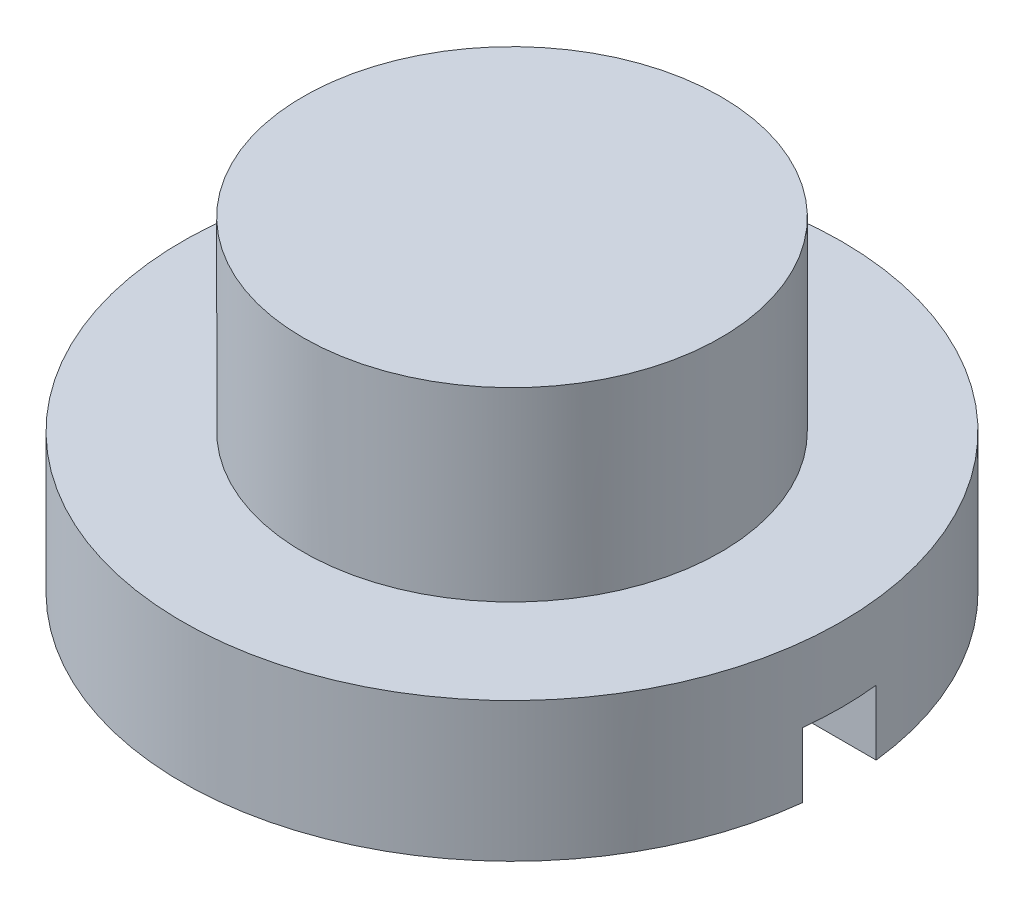
ISO-10303-21;
HEADER;
FILE_DESCRIPTION(('STEP AP214'),'2;1');
FILE_NAME('part.step','',(''),(''),'','','');
FILE_SCHEMA(('AUTOMOTIVE_DESIGN { 1 0 10303 214 1 1 1 1 }'));
ENDSEC;
DATA;
#1=APPLICATION_CONTEXT('core data for automotive mechanical design processes');
#2=APPLICATION_PROTOCOL_DEFINITION('international standard','automotive_design',2000,#1);
#3=PRODUCT_CONTEXT('',#1,'mechanical');
#4=PRODUCT('Part','Part','',(#3));
#5=PRODUCT_RELATED_PRODUCT_CATEGORY('part','',(#4));
#6=PRODUCT_DEFINITION_FORMATION('','',#4);
#7=PRODUCT_DEFINITION_CONTEXT('part definition',#1,'design');
#8=PRODUCT_DEFINITION('design','',#6,#7);
#9=PRODUCT_DEFINITION_SHAPE('','',#8);
#10=(LENGTH_UNIT() NAMED_UNIT(*) SI_UNIT(.MILLI.,.METRE.));
#11=(NAMED_UNIT(*) PLANE_ANGLE_UNIT() SI_UNIT($,.RADIAN.));
#12=(NAMED_UNIT(*) SI_UNIT($,.STERADIAN.) SOLID_ANGLE_UNIT());
#13=UNCERTAINTY_MEASURE_WITH_UNIT(LENGTH_MEASURE(1.E-05),#10,'distance_accuracy_value','');
#14=(GEOMETRIC_REPRESENTATION_CONTEXT(3) GLOBAL_UNCERTAINTY_ASSIGNED_CONTEXT((#13)) GLOBAL_UNIT_ASSIGNED_CONTEXT((#10,
#11,#12)) REPRESENTATION_CONTEXT('',''));
#15=CARTESIAN_POINT('',(0.,0.,0.));
#16=DIRECTION('',(0.,0.,1.));
#17=DIRECTION('',(1.,0.,0.));
#18=AXIS2_PLACEMENT_3D('',#15,#16,#17);
#19=CARTESIAN_POINT('',(-11.7005748371893,-3.81,-6.27870355137579));
#20=DIRECTION('',(0.,-1.,0.));
#21=DIRECTION('',(0.,0.,-1.));
#22=AXIS2_PLACEMENT_3D('',#19,#20,#21);
#23=PLANE('',#22);
#24=DIRECTION('',(1.,0.,0.));
#25=VECTOR('',#24,1.);
#26=CARTESIAN_POINT('',(-11.7005748371893,-3.81,-7.28406224881876));
#27=LINE('',#26,#25);
#28=CARTESIAN_POINT('',(-20.6613528664385,-3.81,-7.28406224881876));
#29=VERTEX_POINT('',#28);
#30=CARTESIAN_POINT('',(-2.73979680794005,-3.81,-7.28406224881876));
#31=VERTEX_POINT('',#30);
#32=EDGE_CURVE('E81',#29,#31,#27,.T.);
#33=ORIENTED_EDGE('',*,*,#32,.F.);
#34=CARTESIAN_POINT('',(-11.7005748371893,-3.81,-6.27870355137579));
#35=DIRECTION('',(0.,-1.,0.));
#36=DIRECTION('',(0.,0.,-1.));
#37=AXIS2_PLACEMENT_3D('',#34,#35,#36);
#38=CIRCLE('',#37,9.017);
#39=EDGE_CURVE('E94',#29,#31,#38,.T.);
#40=ORIENTED_EDGE('',*,*,#39,.T.);
#41=EDGE_LOOP('',(#33,#40));
#42=FACE_BOUND('',#41,.T.);
#43=ADVANCED_FACE('F33',(#42),#23,.T.);
#44=CARTESIAN_POINT('',(-11.7005748371893,5.08,-6.27870355137579));
#45=DIRECTION('',(0.,-1.,0.));
#46=DIRECTION('',(0.,0.,-1.));
#47=AXIS2_PLACEMENT_3D('',#44,#45,#46);
#48=CYLINDRICAL_SURFACE('',#47,5.715);
#49=CARTESIAN_POINT('',(-11.7005748371893,5.08,-6.27870355137579));
#50=DIRECTION('',(0.,1.,0.));
#51=DIRECTION('',(0.,0.,1.));
#52=AXIS2_PLACEMENT_3D('',#49,#50,#51);
#53=CIRCLE('',#52,5.715);
#54=CARTESIAN_POINT('',(-11.7005748371893,5.08,-0.563703551375794));
#55=VERTEX_POINT('',#54);
#56=EDGE_CURVE('E82',#55,#55,#53,.T.);
#57=ORIENTED_EDGE('',*,*,#56,.F.);
#58=EDGE_LOOP('',(#57));
#59=FACE_BOUND('',#58,.T.);
#60=CARTESIAN_POINT('',(-11.7005748371893,0.,-6.27870355137579));
#61=DIRECTION('',(0.,-1.,0.));
#62=DIRECTION('',(0.,0.,-1.));
#63=AXIS2_PLACEMENT_3D('',#60,#61,#62);
#64=CIRCLE('',#63,5.715);
#65=CARTESIAN_POINT('',(-11.7005748371893,0.,-11.9937035513758));
#66=VERTEX_POINT('',#65);
#67=EDGE_CURVE('E93',#66,#66,#64,.T.);
#68=ORIENTED_EDGE('',*,*,#67,.F.);
#69=EDGE_LOOP('',(#68));
#70=FACE_BOUND('',#69,.T.);
#71=ADVANCED_FACE('F35',(#59,#70),#48,.T.);
#72=CARTESIAN_POINT('',(-11.7005748371893,5.08,-6.27870355137579));
#73=DIRECTION('',(0.,1.,0.));
#74=DIRECTION('',(0.,0.,1.));
#75=AXIS2_PLACEMENT_3D('',#72,#73,#74);
#76=PLANE('',#75);
#77=ORIENTED_EDGE('',*,*,#56,.T.);
#78=EDGE_LOOP('',(#77));
#79=FACE_BOUND('',#78,.T.);
#80=ADVANCED_FACE('F116',(#79),#76,.T.);
#81=CARTESIAN_POINT('',(-11.7005748371893,-3.81,-6.27870355137579));
#82=DIRECTION('',(0.,1.,0.));
#83=DIRECTION('',(0.,0.,1.));
#84=AXIS2_PLACEMENT_3D('',#81,#82,#83);
#85=CYLINDRICAL_SURFACE('',#84,9.017);
#86=CARTESIAN_POINT('',(-11.7005748371893,-2.032,-6.27870355137579));
#87=DIRECTION('',(0.,1.,0.));
#88=DIRECTION('',(0.,0.,1.));
#89=AXIS2_PLACEMENT_3D('',#86,#87,#88);
#90=CIRCLE('',#89,9.017);
#91=CARTESIAN_POINT('',(-2.73979680794005,-2.032,-5.27334485393283));
#92=VERTEX_POINT('',#91);
#93=CARTESIAN_POINT('',(-2.73979680794005,-2.032,-7.28406224881876));
#94=VERTEX_POINT('',#93);
#95=EDGE_CURVE('E11',#92,#94,#90,.T.);
#96=ORIENTED_EDGE('',*,*,#95,.T.);
#97=DIRECTION('',(0.,1.,0.));
#98=VECTOR('',#97,1.);
#99=CARTESIAN_POINT('',(-2.73979680794005,-3.81,-7.28406224881876));
#100=LINE('',#99,#98);
#101=EDGE_CURVE('E56',#94,#31,#100,.F.);
#102=ORIENTED_EDGE('',*,*,#101,.T.);
#103=ORIENTED_EDGE('',*,*,#39,.F.);
#104=DIRECTION('',(0.,1.,0.));
#105=VECTOR('',#104,1.);
#106=CARTESIAN_POINT('',(-20.6613528664385,-3.81,-7.28406224881876));
#107=LINE('',#106,#105);
#108=CARTESIAN_POINT('',(-20.6613528664385,-2.032,-7.28406224881876));
#109=VERTEX_POINT('',#108);
#110=EDGE_CURVE('E102',#29,#109,#107,.T.);
#111=ORIENTED_EDGE('',*,*,#110,.T.);
#112=CARTESIAN_POINT('',(-20.6613528664385,-2.032,-5.27334485393283));
#113=VERTEX_POINT('',#112);
#114=EDGE_CURVE('E37',#109,#113,#90,.T.);
#115=ORIENTED_EDGE('',*,*,#114,.T.);
#116=DIRECTION('',(0.,1.,0.));
#117=VECTOR('',#116,1.);
#118=CARTESIAN_POINT('',(-20.6613528664385,-3.81,-5.27334485393283));
#119=LINE('',#118,#117);
#120=CARTESIAN_POINT('',(-20.6613528664385,-3.81,-5.27334485393283));
#121=VERTEX_POINT('',#120);
#122=EDGE_CURVE('E76',#113,#121,#119,.F.);
#123=ORIENTED_EDGE('',*,*,#122,.T.);
#124=CARTESIAN_POINT('',(-2.73979680794005,-3.81,-5.27334485393283));
#125=VERTEX_POINT('',#124);
#126=EDGE_CURVE('E88',#125,#121,#38,.T.);
#127=ORIENTED_EDGE('',*,*,#126,.F.);
#128=DIRECTION('',(0.,1.,0.));
#129=VECTOR('',#128,1.);
#130=CARTESIAN_POINT('',(-2.73979680794005,-3.81,-5.27334485393283));
#131=LINE('',#130,#129);
#132=EDGE_CURVE('E48',#125,#92,#131,.T.);
#133=ORIENTED_EDGE('',*,*,#132,.T.);
#134=EDGE_LOOP('',(#96,#102,#103,#111,#115,#123,#127,#133));
#135=FACE_BOUND('',#134,.T.);
#136=CARTESIAN_POINT('',(-11.7005748371893,0.,-6.27870355137579));
#137=DIRECTION('',(0.,-1.,0.));
#138=DIRECTION('',(0.,0.,-1.));
#139=AXIS2_PLACEMENT_3D('',#136,#137,#138);
#140=CIRCLE('',#139,9.017);
#141=CARTESIAN_POINT('',(-11.7005748371893,0.,-15.2957035513758));
#142=VERTEX_POINT('',#141);
#143=EDGE_CURVE('E99',#142,#142,#140,.T.);
#144=ORIENTED_EDGE('',*,*,#143,.T.);
#145=EDGE_LOOP('',(#144));
#146=FACE_BOUND('',#145,.T.);
#147=ADVANCED_FACE('F86',(#135,#146),#85,.T.);
#148=DIRECTION('',(-1.,0.,0.));
#149=VECTOR('',#148,1.);
#150=CARTESIAN_POINT('',(-11.7005748371893,-3.81,-5.27334485393283));
#151=LINE('',#150,#149);
#152=EDGE_CURVE('E73',#125,#121,#151,.T.);
#153=ORIENTED_EDGE('',*,*,#152,.F.);
#154=ORIENTED_EDGE('',*,*,#126,.T.);
#155=EDGE_LOOP('',(#153,#154));
#156=FACE_BOUND('',#155,.T.);
#157=ADVANCED_FACE('F92',(#156),#23,.T.);
#158=CARTESIAN_POINT('',(-11.7005748371893,0.,-6.27870355137579));
#159=DIRECTION('',(0.,-1.,0.));
#160=DIRECTION('',(0.,0.,-1.));
#161=AXIS2_PLACEMENT_3D('',#158,#159,#160);
#162=PLANE('',#161);
#163=ORIENTED_EDGE('',*,*,#67,.T.);
#164=EDGE_LOOP('',(#163));
#165=FACE_BOUND('',#164,.T.);
#166=ORIENTED_EDGE('',*,*,#143,.F.);
#167=EDGE_LOOP('',(#166));
#168=FACE_BOUND('',#167,.T.);
#169=ADVANCED_FACE('F121',(#165,#168),#162,.F.);
#170=CARTESIAN_POINT('',(0.,-2.032,0.));
#171=DIRECTION('',(0.,1.,0.));
#172=DIRECTION('',(0.,0.,1.));
#173=AXIS2_PLACEMENT_3D('',#170,#171,#172);
#174=PLANE('',#173);
#175=DIRECTION('',(-1.,0.,0.));
#176=VECTOR('',#175,1.);
#177=CARTESIAN_POINT('',(-21.0446979293063,-2.032,-5.27334485393283));
#178=LINE('',#177,#176);
#179=EDGE_CURVE('E192',#92,#113,#178,.T.);
#180=ORIENTED_EDGE('',*,*,#179,.T.);
#181=ORIENTED_EDGE('',*,*,#114,.F.);
#182=DIRECTION('',(1.,0.,0.));
#183=VECTOR('',#182,1.);
#184=CARTESIAN_POINT('',(-21.0446979293063,-2.032,-7.28406224881876));
#185=LINE('',#184,#183);
#186=EDGE_CURVE('E90',#109,#94,#185,.T.);
#187=ORIENTED_EDGE('',*,*,#186,.T.);
#188=ORIENTED_EDGE('',*,*,#95,.F.);
#189=EDGE_LOOP('',(#180,#181,#187,#188));
#190=FACE_BOUND('',#189,.T.);
#191=ADVANCED_FACE('F126',(#190),#174,.F.);
#192=CARTESIAN_POINT('',(-21.0446979293063,-2.032,-7.28406224881876));
#193=DIRECTION('',(0.,0.,-1.));
#194=DIRECTION('',(-1.,0.,0.));
#195=AXIS2_PLACEMENT_3D('',#192,#193,#194);
#196=PLANE('',#195);
#197=ORIENTED_EDGE('',*,*,#32,.T.);
#198=ORIENTED_EDGE('',*,*,#101,.F.);
#199=ORIENTED_EDGE('',*,*,#186,.F.);
#200=ORIENTED_EDGE('',*,*,#110,.F.);
#201=EDGE_LOOP('',(#197,#198,#199,#200));
#202=FACE_BOUND('',#201,.T.);
#203=ADVANCED_FACE('F108',(#202),#196,.F.);
#204=CARTESIAN_POINT('',(-21.0446979293063,-2.032,-5.27334485393283));
#205=DIRECTION('',(0.,0.,1.));
#206=DIRECTION('',(1.,0.,0.));
#207=AXIS2_PLACEMENT_3D('',#204,#205,#206);
#208=PLANE('',#207);
#209=ORIENTED_EDGE('',*,*,#152,.T.);
#210=ORIENTED_EDGE('',*,*,#122,.F.);
#211=ORIENTED_EDGE('',*,*,#179,.F.);
#212=ORIENTED_EDGE('',*,*,#132,.F.);
#213=EDGE_LOOP('',(#209,#210,#211,#212));
#214=FACE_BOUND('',#213,.T.);
#215=ADVANCED_FACE('F75',(#214),#208,.F.);
#216=CLOSED_SHELL('',(#43,#71,#80,#147,#157,#169,#191,#203,#215));
#217=MANIFOLD_SOLID_BREP('B2',#216);
#218=ADVANCED_BREP_SHAPE_REPRESENTATION('',(#18,#217),#14);
#219=SHAPE_DEFINITION_REPRESENTATION(#9,#218);
ENDSEC;
END-ISO-10303-21;
